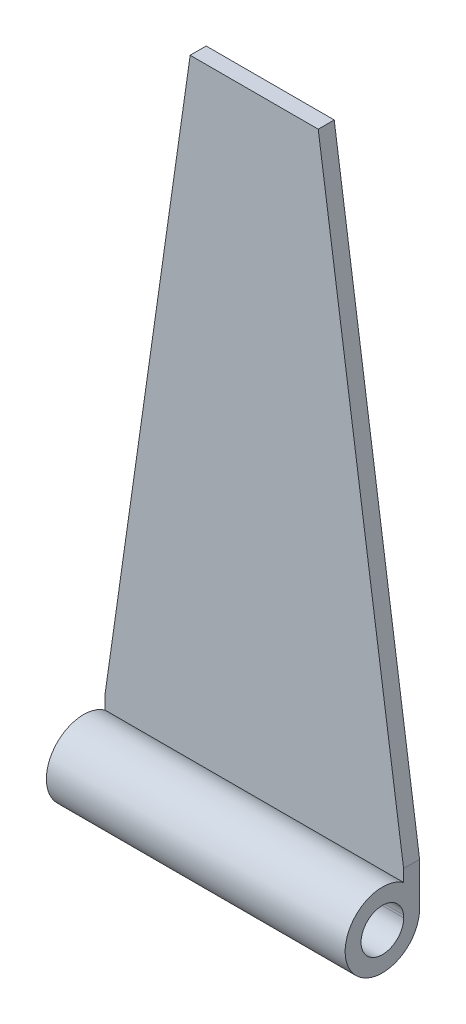
ISO-10303-21;
HEADER;
FILE_DESCRIPTION(('STEP AP214'),'2;1');
FILE_NAME('part.step','',(''),(''),'','','');
FILE_SCHEMA(('AUTOMOTIVE_DESIGN { 1 0 10303 214 1 1 1 1 }'));
ENDSEC;
DATA;
#1=APPLICATION_CONTEXT('core data for automotive mechanical design processes');
#2=APPLICATION_PROTOCOL_DEFINITION('international standard','automotive_design',2000,#1);
#3=PRODUCT_CONTEXT('',#1,'mechanical');
#4=PRODUCT('Part','Part','',(#3));
#5=PRODUCT_RELATED_PRODUCT_CATEGORY('part','',(#4));
#6=PRODUCT_DEFINITION_FORMATION('','',#4);
#7=PRODUCT_DEFINITION_CONTEXT('part definition',#1,'design');
#8=PRODUCT_DEFINITION('design','',#6,#7);
#9=PRODUCT_DEFINITION_SHAPE('','',#8);
#10=(LENGTH_UNIT() NAMED_UNIT(*) SI_UNIT(.MILLI.,.METRE.));
#11=(NAMED_UNIT(*) PLANE_ANGLE_UNIT() SI_UNIT($,.RADIAN.));
#12=(NAMED_UNIT(*) SI_UNIT($,.STERADIAN.) SOLID_ANGLE_UNIT());
#13=UNCERTAINTY_MEASURE_WITH_UNIT(LENGTH_MEASURE(1.E-05),#10,'distance_accuracy_value','');
#14=(GEOMETRIC_REPRESENTATION_CONTEXT(3) GLOBAL_UNCERTAINTY_ASSIGNED_CONTEXT((#13)) GLOBAL_UNIT_ASSIGNED_CONTEXT((#10,
#11,#12)) REPRESENTATION_CONTEXT('',''));
#15=CARTESIAN_POINT('',(0.,0.,0.));
#16=DIRECTION('',(0.,0.,1.));
#17=DIRECTION('',(1.,0.,0.));
#18=AXIS2_PLACEMENT_3D('',#15,#16,#17);
#19=CARTESIAN_POINT('',(0.,0.,0.5953125));
#20=DIRECTION('',(0.,0.,1.));
#21=DIRECTION('',(1.,0.,0.));
#22=AXIS2_PLACEMENT_3D('',#19,#20,#21);
#23=PLANE('',#22);
#24=DIRECTION('',(0.,-1.,0.));
#25=VECTOR('',#24,1.);
#26=CARTESIAN_POINT('',(-11.1125,-20.6375,0.5953125));
#27=LINE('',#26,#25);
#28=CARTESIAN_POINT('',(-11.1125,-20.6375,0.5953125));
#29=VERTEX_POINT('',#28);
#30=CARTESIAN_POINT('',(-11.1125,-21.5376064070214,0.5953125));
#31=VERTEX_POINT('',#30);
#32=EDGE_CURVE('E146',#29,#31,#27,.T.);
#33=ORIENTED_EDGE('',*,*,#32,.T.);
#34=DIRECTION('',(-1.,0.,0.));
#35=VECTOR('',#34,1.);
#36=CARTESIAN_POINT('',(11.1125,-21.5376064070214,0.5953125));
#37=LINE('',#36,#35);
#38=CARTESIAN_POINT('',(11.1125,-21.5376064070214,0.5953125));
#39=VERTEX_POINT('',#38);
#40=EDGE_CURVE('E129',#31,#39,#37,.F.);
#41=ORIENTED_EDGE('',*,*,#40,.T.);
#42=DIRECTION('',(0.,1.,0.));
#43=VECTOR('',#42,1.);
#44=CARTESIAN_POINT('',(11.1125,-23.8125,0.5953125));
#45=LINE('',#44,#43);
#46=CARTESIAN_POINT('',(11.1125,-20.6375,0.5953125));
#47=VERTEX_POINT('',#46);
#48=EDGE_CURVE('E128',#39,#47,#45,.T.);
#49=ORIENTED_EDGE('',*,*,#48,.T.);
#50=DIRECTION('',(-0.14142135623731,0.989949493661167,0.));
#51=VECTOR('',#50,1.);
#52=CARTESIAN_POINT('',(4.7625,23.8125,0.5953125));
#53=LINE('',#52,#51);
#54=CARTESIAN_POINT('',(4.7625,23.8125,0.5953125));
#55=VERTEX_POINT('',#54);
#56=EDGE_CURVE('E152',#47,#55,#53,.T.);
#57=ORIENTED_EDGE('',*,*,#56,.T.);
#58=DIRECTION('',(-1.,0.,0.));
#59=VECTOR('',#58,1.);
#60=CARTESIAN_POINT('',(-4.7625,23.8125,0.5953125));
#61=LINE('',#60,#59);
#62=CARTESIAN_POINT('',(-4.7625,23.8125,0.5953125));
#63=VERTEX_POINT('',#62);
#64=EDGE_CURVE('E140',#55,#63,#61,.T.);
#65=ORIENTED_EDGE('',*,*,#64,.T.);
#66=DIRECTION('',(-0.141421356237309,-0.989949493661166,0.));
#67=VECTOR('',#66,1.);
#68=CARTESIAN_POINT('',(-11.1125,-20.6375,0.5953125));
#69=LINE('',#68,#67);
#70=EDGE_CURVE('E143',#63,#29,#69,.T.);
#71=ORIENTED_EDGE('',*,*,#70,.T.);
#72=EDGE_LOOP('',(#33,#41,#49,#57,#65,#71));
#73=FACE_BOUND('',#72,.T.);
#74=ADVANCED_FACE('F32',(#73),#23,.T.);
#75=CARTESIAN_POINT('',(-4.7625,23.8125,0.5953125));
#76=DIRECTION('',(0.,-1.,0.));
#77=DIRECTION('',(0.,0.,-1.));
#78=AXIS2_PLACEMENT_3D('',#75,#76,#77);
#79=PLANE('',#78);
#80=DIRECTION('',(-1.,0.,0.));
#81=VECTOR('',#80,1.);
#82=CARTESIAN_POINT('',(-4.7625,23.8125,-0.5953125));
#83=LINE('',#82,#81);
#84=CARTESIAN_POINT('',(4.7625,23.8125,-0.5953125));
#85=VERTEX_POINT('',#84);
#86=CARTESIAN_POINT('',(-4.7625,23.8125,-0.5953125));
#87=VERTEX_POINT('',#86);
#88=EDGE_CURVE('E139',#85,#87,#83,.T.);
#89=ORIENTED_EDGE('',*,*,#88,.T.);
#90=DIRECTION('',(0.,0.,-1.));
#91=VECTOR('',#90,1.);
#92=CARTESIAN_POINT('',(-4.7625,23.8125,0.5953125));
#93=LINE('',#92,#91);
#94=EDGE_CURVE('E40',#63,#87,#93,.T.);
#95=ORIENTED_EDGE('',*,*,#94,.F.);
#96=ORIENTED_EDGE('',*,*,#64,.F.);
#97=DIRECTION('',(0.,0.,-1.));
#98=VECTOR('',#97,1.);
#99=CARTESIAN_POINT('',(4.7625,23.8125,0.5953125));
#100=LINE('',#99,#98);
#101=EDGE_CURVE('E154',#55,#85,#100,.T.);
#102=ORIENTED_EDGE('',*,*,#101,.T.);
#103=EDGE_LOOP('',(#89,#95,#96,#102));
#104=FACE_BOUND('',#103,.T.);
#105=ADVANCED_FACE('F34',(#104),#79,.F.);
#106=CARTESIAN_POINT('',(-11.1125,-20.6375,0.5953125));
#107=DIRECTION('',(0.989949493661167,-0.141421356237309,0.));
#108=DIRECTION('',(0.141421356237309,0.989949493661167,0.));
#109=AXIS2_PLACEMENT_3D('',#106,#107,#108);
#110=PLANE('',#109);
#111=DIRECTION('',(-0.141421356237309,-0.989949493661166,0.));
#112=VECTOR('',#111,1.);
#113=CARTESIAN_POINT('',(-11.1125,-20.6375,-0.5953125));
#114=LINE('',#113,#112);
#115=CARTESIAN_POINT('',(-11.1125,-20.6375,-0.5953125));
#116=VERTEX_POINT('',#115);
#117=EDGE_CURVE('E157',#87,#116,#114,.T.);
#118=ORIENTED_EDGE('',*,*,#117,.T.);
#119=DIRECTION('',(0.,0.,-1.));
#120=VECTOR('',#119,1.);
#121=CARTESIAN_POINT('',(-11.1125,-20.6375,0.5953125));
#122=LINE('',#121,#120);
#123=EDGE_CURVE('E168',#29,#116,#122,.T.);
#124=ORIENTED_EDGE('',*,*,#123,.F.);
#125=ORIENTED_EDGE('',*,*,#70,.F.);
#126=ORIENTED_EDGE('',*,*,#94,.T.);
#127=EDGE_LOOP('',(#118,#124,#125,#126));
#128=FACE_BOUND('',#127,.T.);
#129=ADVANCED_FACE('F173',(#128),#110,.F.);
#130=CARTESIAN_POINT('',(-11.1125,-20.6375,0.5953125));
#131=DIRECTION('',(1.,0.,0.));
#132=DIRECTION('',(0.,0.,-1.));
#133=AXIS2_PLACEMENT_3D('',#130,#131,#132);
#134=PLANE('',#133);
#135=DIRECTION('',(0.,-1.,0.));
#136=VECTOR('',#135,1.);
#137=CARTESIAN_POINT('',(-11.1125,-20.6375,-0.5953125));
#138=LINE('',#137,#136);
#139=CARTESIAN_POINT('',(-11.1125,-23.8125,-0.5953125));
#140=VERTEX_POINT('',#139);
#141=EDGE_CURVE('E123',#116,#140,#138,.T.);
#142=ORIENTED_EDGE('',*,*,#141,.T.);
#143=CARTESIAN_POINT('',(-11.1125,-23.8125,2.1732875));
#144=DIRECTION('',(1.,0.,0.));
#145=DIRECTION('',(0.,0.,-1.));
#146=AXIS2_PLACEMENT_3D('',#143,#144,#145);
#147=CIRCLE('',#146,2.7686);
#148=EDGE_CURVE('E122',#31,#140,#147,.T.);
#149=ORIENTED_EDGE('',*,*,#148,.F.);
#150=ORIENTED_EDGE('',*,*,#32,.F.);
#151=ORIENTED_EDGE('',*,*,#123,.T.);
#152=EDGE_LOOP('',(#142,#149,#150,#151));
#153=FACE_BOUND('',#152,.T.);
#154=CARTESIAN_POINT('',(-11.1125,-23.6388591367938,0.5953125));
#155=VERTEX_POINT('',#154);
#156=CARTESIAN_POINT('',(-11.1125,-23.8125,0.5953125));
#157=VERTEX_POINT('',#156);
#158=EDGE_CURVE('E145',#155,#157,#27,.T.);
#159=ORIENTED_EDGE('',*,*,#158,.F.);
#160=CARTESIAN_POINT('',(-11.1125,-23.8125,2.1732875));
#161=DIRECTION('',(1.,0.,0.));
#162=DIRECTION('',(0.,0.,-1.));
#163=AXIS2_PLACEMENT_3D('',#160,#161,#162);
#164=CIRCLE('',#163,1.5875);
#165=CARTESIAN_POINT('',(-11.1125,-23.8125,0.585787499999999));
#166=VERTEX_POINT('',#165);
#167=EDGE_CURVE('E135',#155,#166,#164,.T.);
#168=ORIENTED_EDGE('',*,*,#167,.T.);
#169=DIRECTION('',(0.,0.,-1.));
#170=VECTOR('',#169,1.);
#171=CARTESIAN_POINT('',(-11.1125,-23.8125,0.5953125));
#172=LINE('',#171,#170);
#173=EDGE_CURVE('E47',#157,#166,#172,.T.);
#174=ORIENTED_EDGE('',*,*,#173,.F.);
#175=EDGE_LOOP('',(#159,#168,#174));
#176=FACE_BOUND('',#175,.T.);
#177=ADVANCED_FACE('F179',(#153,#176),#134,.F.);
#178=CARTESIAN_POINT('',(-11.1125,-23.8125,0.5953125));
#179=DIRECTION('',(0.,1.,0.));
#180=DIRECTION('',(-1.,0.,0.));
#181=AXIS2_PLACEMENT_3D('',#178,#179,#180);
#182=PLANE('',#181);
#183=ORIENTED_EDGE('',*,*,#173,.T.);
#184=DIRECTION('',(-1.,0.,0.));
#185=VECTOR('',#184,1.);
#186=CARTESIAN_POINT('',(11.1125,-23.8125,0.585787499999999));
#187=LINE('',#186,#185);
#188=CARTESIAN_POINT('',(11.1125,-23.8125,0.585787499999999));
#189=VERTEX_POINT('',#188);
#190=EDGE_CURVE('E51',#166,#189,#187,.F.);
#191=ORIENTED_EDGE('',*,*,#190,.T.);
#192=DIRECTION('',(0.,0.,-1.));
#193=VECTOR('',#192,1.);
#194=CARTESIAN_POINT('',(11.1125,-23.8125,0.5953125));
#195=LINE('',#194,#193);
#196=CARTESIAN_POINT('',(11.1125,-23.8125,0.5953125));
#197=VERTEX_POINT('',#196);
#198=EDGE_CURVE('E165',#197,#189,#195,.T.);
#199=ORIENTED_EDGE('',*,*,#198,.F.);
#200=DIRECTION('',(1.,0.,0.));
#201=VECTOR('',#200,1.);
#202=CARTESIAN_POINT('',(-11.1125,-23.8125,0.5953125));
#203=LINE('',#202,#201);
#204=EDGE_CURVE('E148',#157,#197,#203,.T.);
#205=ORIENTED_EDGE('',*,*,#204,.F.);
#206=EDGE_LOOP('',(#183,#191,#199,#205));
#207=FACE_BOUND('',#206,.T.);
#208=ADVANCED_FACE('F195',(#207),#182,.F.);
#209=CARTESIAN_POINT('',(11.1125,-23.8125,0.5953125));
#210=DIRECTION('',(-1.,0.,0.));
#211=DIRECTION('',(0.,0.,1.));
#212=AXIS2_PLACEMENT_3D('',#209,#210,#211);
#213=PLANE('',#212);
#214=CARTESIAN_POINT('',(11.1125,-23.8125,2.1732875));
#215=DIRECTION('',(1.,0.,0.));
#216=DIRECTION('',(0.,0.,-1.));
#217=AXIS2_PLACEMENT_3D('',#214,#215,#216);
#218=CIRCLE('',#217,2.7686);
#219=CARTESIAN_POINT('',(11.1125,-23.8125,-0.595312500000001));
#220=VERTEX_POINT('',#219);
#221=EDGE_CURVE('E120',#39,#220,#218,.T.);
#222=ORIENTED_EDGE('',*,*,#221,.T.);
#223=DIRECTION('',(0.,1.,0.));
#224=VECTOR('',#223,1.);
#225=CARTESIAN_POINT('',(11.1125,-23.8125,-0.5953125));
#226=LINE('',#225,#224);
#227=CARTESIAN_POINT('',(11.1125,-20.6375,-0.5953125));
#228=VERTEX_POINT('',#227);
#229=EDGE_CURVE('E103',#220,#228,#226,.T.);
#230=ORIENTED_EDGE('',*,*,#229,.T.);
#231=DIRECTION('',(0.,0.,-1.));
#232=VECTOR('',#231,1.);
#233=CARTESIAN_POINT('',(11.1125,-20.6375,0.5953125));
#234=LINE('',#233,#232);
#235=EDGE_CURVE('E163',#47,#228,#234,.T.);
#236=ORIENTED_EDGE('',*,*,#235,.F.);
#237=ORIENTED_EDGE('',*,*,#48,.F.);
#238=EDGE_LOOP('',(#222,#230,#236,#237));
#239=FACE_BOUND('',#238,.T.);
#240=ORIENTED_EDGE('',*,*,#198,.T.);
#241=CARTESIAN_POINT('',(11.1125,-23.8125,2.1732875));
#242=DIRECTION('',(1.,0.,0.));
#243=DIRECTION('',(0.,0.,-1.));
#244=AXIS2_PLACEMENT_3D('',#241,#242,#243);
#245=CIRCLE('',#244,1.5875);
#246=CARTESIAN_POINT('',(11.1125,-23.6388591367938,0.5953125));
#247=VERTEX_POINT('',#246);
#248=EDGE_CURVE('E132',#247,#189,#245,.T.);
#249=ORIENTED_EDGE('',*,*,#248,.F.);
#250=EDGE_CURVE('E150',#197,#247,#45,.T.);
#251=ORIENTED_EDGE('',*,*,#250,.F.);
#252=EDGE_LOOP('',(#240,#249,#251));
#253=FACE_BOUND('',#252,.T.);
#254=ADVANCED_FACE('F126',(#239,#253),#213,.F.);
#255=CARTESIAN_POINT('',(4.7625,23.8125,0.5953125));
#256=DIRECTION('',(-0.989949493661166,-0.14142135623731,0.));
#257=DIRECTION('',(0.14142135623731,-0.989949493661167,0.));
#258=AXIS2_PLACEMENT_3D('',#255,#256,#257);
#259=PLANE('',#258);
#260=DIRECTION('',(-0.14142135623731,0.989949493661167,0.));
#261=VECTOR('',#260,1.);
#262=CARTESIAN_POINT('',(4.7625,23.8125,-0.5953125));
#263=LINE('',#262,#261);
#264=EDGE_CURVE('E110',#228,#85,#263,.T.);
#265=ORIENTED_EDGE('',*,*,#264,.T.);
#266=ORIENTED_EDGE('',*,*,#101,.F.);
#267=ORIENTED_EDGE('',*,*,#56,.F.);
#268=ORIENTED_EDGE('',*,*,#235,.T.);
#269=EDGE_LOOP('',(#265,#266,#267,#268));
#270=FACE_BOUND('',#269,.T.);
#271=ADVANCED_FACE('F185',(#270),#259,.F.);
#272=DIRECTION('',(-1.,0.,0.));
#273=VECTOR('',#272,1.);
#274=CARTESIAN_POINT('',(11.1125,-23.6388591367938,0.5953125));
#275=LINE('',#274,#273);
#276=EDGE_CURVE('E11',#155,#247,#275,.F.);
#277=ORIENTED_EDGE('',*,*,#276,.F.);
#278=ORIENTED_EDGE('',*,*,#158,.T.);
#279=ORIENTED_EDGE('',*,*,#204,.T.);
#280=ORIENTED_EDGE('',*,*,#250,.T.);
#281=EDGE_LOOP('',(#277,#278,#279,#280));
#282=FACE_BOUND('',#281,.T.);
#283=ADVANCED_FACE('F187',(#282),#23,.T.);
#284=CARTESIAN_POINT('',(0.,0.,-0.5953125));
#285=DIRECTION('',(0.,0.,1.));
#286=DIRECTION('',(1.,0.,0.));
#287=AXIS2_PLACEMENT_3D('',#284,#285,#286);
#288=PLANE('',#287);
#289=ORIENTED_EDGE('',*,*,#88,.F.);
#290=ORIENTED_EDGE('',*,*,#264,.F.);
#291=ORIENTED_EDGE('',*,*,#229,.F.);
#292=DIRECTION('',(1.,0.,0.));
#293=VECTOR('',#292,1.);
#294=CARTESIAN_POINT('',(-11.1125,-23.8125,-0.5953125));
#295=LINE('',#294,#293);
#296=EDGE_CURVE('E108',#140,#220,#295,.T.);
#297=ORIENTED_EDGE('',*,*,#296,.F.);
#298=ORIENTED_EDGE('',*,*,#141,.F.);
#299=ORIENTED_EDGE('',*,*,#117,.F.);
#300=EDGE_LOOP('',(#289,#290,#291,#297,#298,#299));
#301=FACE_BOUND('',#300,.T.);
#302=ADVANCED_FACE('F106',(#301),#288,.F.);
#303=CARTESIAN_POINT('',(11.1125,-23.8125,2.1732875));
#304=DIRECTION('',(-1.,0.,0.));
#305=DIRECTION('',(0.,0.,1.));
#306=AXIS2_PLACEMENT_3D('',#303,#304,#305);
#307=CYLINDRICAL_SURFACE('',#306,1.5875);
#308=ORIENTED_EDGE('',*,*,#190,.F.);
#309=ORIENTED_EDGE('',*,*,#167,.F.);
#310=ORIENTED_EDGE('',*,*,#276,.T.);
#311=ORIENTED_EDGE('',*,*,#248,.T.);
#312=EDGE_LOOP('',(#308,#309,#310,#311));
#313=FACE_BOUND('',#312,.T.);
#314=ADVANCED_FACE('F205',(#313),#307,.F.);
#315=CARTESIAN_POINT('',(11.1125,-23.8125,2.1732875));
#316=DIRECTION('',(-1.,0.,0.));
#317=DIRECTION('',(0.,0.,1.));
#318=AXIS2_PLACEMENT_3D('',#315,#316,#317);
#319=CYLINDRICAL_SURFACE('',#318,2.7686);
#320=ORIENTED_EDGE('',*,*,#40,.F.);
#321=ORIENTED_EDGE('',*,*,#148,.T.);
#322=ORIENTED_EDGE('',*,*,#296,.T.);
#323=ORIENTED_EDGE('',*,*,#221,.F.);
#324=EDGE_LOOP('',(#320,#321,#322,#323));
#325=FACE_BOUND('',#324,.T.);
#326=ADVANCED_FACE('F119',(#325),#319,.T.);
#327=CLOSED_SHELL('',(#74,#105,#129,#177,#208,#254,#271,#283,#302,#314,#326));
#328=MANIFOLD_SOLID_BREP('B2',#327);
#329=ADVANCED_BREP_SHAPE_REPRESENTATION('',(#18,#328),#14);
#330=SHAPE_DEFINITION_REPRESENTATION(#9,#329);
ENDSEC;
END-ISO-10303-21;
